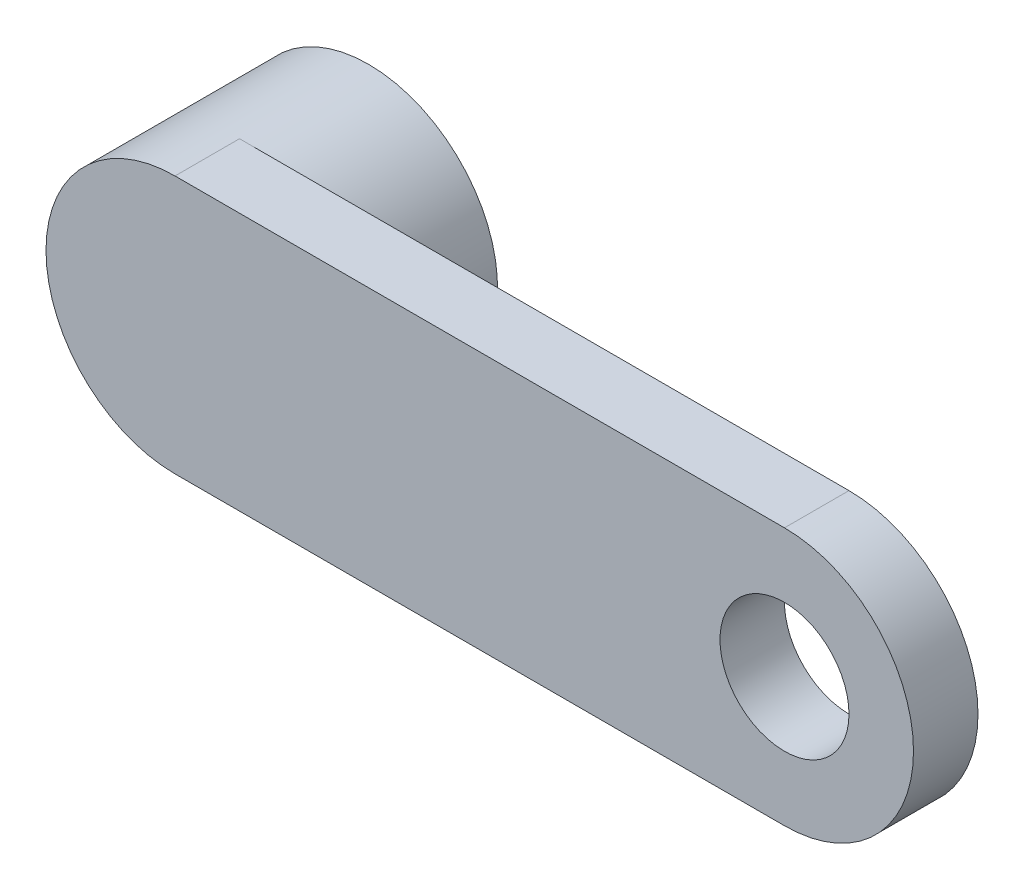
ISO-10303-21;
HEADER;
FILE_DESCRIPTION(('STEP AP214'),'2;1');
FILE_NAME('part.step','',(''),(''),'','','');
FILE_SCHEMA(('AUTOMOTIVE_DESIGN { 1 0 10303 214 1 1 1 1 }'));
ENDSEC;
DATA;
#1=APPLICATION_CONTEXT('core data for automotive mechanical design processes');
#2=APPLICATION_PROTOCOL_DEFINITION('international standard','automotive_design',2000,#1);
#3=PRODUCT_CONTEXT('',#1,'mechanical');
#4=PRODUCT('Part','Part','',(#3));
#5=PRODUCT_RELATED_PRODUCT_CATEGORY('part','',(#4));
#6=PRODUCT_DEFINITION_FORMATION('','',#4);
#7=PRODUCT_DEFINITION_CONTEXT('part definition',#1,'design');
#8=PRODUCT_DEFINITION('design','',#6,#7);
#9=PRODUCT_DEFINITION_SHAPE('','',#8);
#10=(LENGTH_UNIT() NAMED_UNIT(*) SI_UNIT(.MILLI.,.METRE.));
#11=(NAMED_UNIT(*) PLANE_ANGLE_UNIT() SI_UNIT($,.RADIAN.));
#12=(NAMED_UNIT(*) SI_UNIT($,.STERADIAN.) SOLID_ANGLE_UNIT());
#13=UNCERTAINTY_MEASURE_WITH_UNIT(LENGTH_MEASURE(1.E-05),#10,'distance_accuracy_value','');
#14=(GEOMETRIC_REPRESENTATION_CONTEXT(3) GLOBAL_UNCERTAINTY_ASSIGNED_CONTEXT((#13)) GLOBAL_UNIT_ASSIGNED_CONTEXT((#10,
#11,#12)) REPRESENTATION_CONTEXT('',''));
#15=CARTESIAN_POINT('',(0.,0.,0.));
#16=DIRECTION('',(0.,0.,1.));
#17=DIRECTION('',(1.,0.,0.));
#18=AXIS2_PLACEMENT_3D('',#15,#16,#17);
#19=CARTESIAN_POINT('',(0.,0.,-1.5875));
#20=DIRECTION('',(0.,0.,1.));
#21=DIRECTION('',(1.,0.,0.));
#22=AXIS2_PLACEMENT_3D('',#19,#20,#21);
#23=PLANE('',#22);
#24=CARTESIAN_POINT('',(15.,0.,-1.5875));
#25=DIRECTION('',(0.,0.,1.));
#26=DIRECTION('',(1.,0.,0.));
#27=AXIS2_PLACEMENT_3D('',#24,#25,#26);
#28=CIRCLE('',#27,1.5875);
#29=CARTESIAN_POINT('',(16.5875,0.,-1.5875));
#30=VERTEX_POINT('',#29);
#31=EDGE_CURVE('E112',#30,#30,#28,.T.);
#32=ORIENTED_EDGE('',*,*,#31,.T.);
#33=EDGE_LOOP('',(#32));
#34=FACE_BOUND('',#33,.T.);
#35=CARTESIAN_POINT('',(0.,0.,-1.5875));
#36=DIRECTION('',(0.,0.,-1.));
#37=DIRECTION('',(-1.,0.,0.));
#38=AXIS2_PLACEMENT_3D('',#35,#36,#37);
#39=CIRCLE('',#38,3.175);
#40=CARTESIAN_POINT('',(0.,3.175,-1.5875));
#41=VERTEX_POINT('',#40);
#42=CARTESIAN_POINT('',(0.,-3.175,-1.5875));
#43=VERTEX_POINT('',#42);
#44=EDGE_CURVE('E74',#41,#43,#39,.T.);
#45=ORIENTED_EDGE('',*,*,#44,.F.);
#46=DIRECTION('',(-1.,0.,0.));
#47=VECTOR('',#46,1.);
#48=CARTESIAN_POINT('',(0.,3.175,-1.5875));
#49=LINE('',#48,#47);
#50=CARTESIAN_POINT('',(15.,3.175,-1.5875));
#51=VERTEX_POINT('',#50);
#52=EDGE_CURVE('E81',#51,#41,#49,.T.);
#53=ORIENTED_EDGE('',*,*,#52,.F.);
#54=CARTESIAN_POINT('',(15.,0.,-1.5875));
#55=DIRECTION('',(0.,0.,1.));
#56=DIRECTION('',(1.,0.,0.));
#57=AXIS2_PLACEMENT_3D('',#54,#55,#56);
#58=CIRCLE('',#57,3.175);
#59=CARTESIAN_POINT('',(15.,-3.17499999999994,-1.5875));
#60=VERTEX_POINT('',#59);
#61=EDGE_CURVE('E93',#60,#51,#58,.T.);
#62=ORIENTED_EDGE('',*,*,#61,.F.);
#63=DIRECTION('',(1.,0.,0.));
#64=VECTOR('',#63,1.);
#65=CARTESIAN_POINT('',(0.,-3.175,-1.5875));
#66=LINE('',#65,#64);
#67=EDGE_CURVE('E83',#43,#60,#66,.T.);
#68=ORIENTED_EDGE('',*,*,#67,.F.);
#69=EDGE_LOOP('',(#45,#53,#62,#68));
#70=FACE_BOUND('',#69,.T.);
#71=ADVANCED_FACE('F34',(#34,#70),#23,.F.);
#72=CARTESIAN_POINT('',(0.,0.,-1.5875));
#73=DIRECTION('',(0.,0.,1.));
#74=DIRECTION('',(1.,0.,0.));
#75=AXIS2_PLACEMENT_3D('',#72,#73,#74);
#76=CYLINDRICAL_SURFACE('',#75,3.175);
#77=CARTESIAN_POINT('',(0.,0.,0.));
#78=DIRECTION('',(0.,0.,1.));
#79=DIRECTION('',(1.,0.,0.));
#80=AXIS2_PLACEMENT_3D('',#77,#78,#79);
#81=CIRCLE('',#80,3.175);
#82=CARTESIAN_POINT('',(0.,3.175,0.));
#83=VERTEX_POINT('',#82);
#84=CARTESIAN_POINT('',(0.,-3.175,0.));
#85=VERTEX_POINT('',#84);
#86=EDGE_CURVE('E89',#83,#85,#81,.T.);
#87=ORIENTED_EDGE('',*,*,#86,.F.);
#88=DIRECTION('',(0.,0.,1.));
#89=VECTOR('',#88,1.);
#90=CARTESIAN_POINT('',(0.,3.175,-1.5875));
#91=LINE('',#90,#89);
#92=EDGE_CURVE('E11',#41,#83,#91,.T.);
#93=ORIENTED_EDGE('',*,*,#92,.F.);
#94=ORIENTED_EDGE('',*,*,#44,.T.);
#95=DIRECTION('',(0.,0.,1.));
#96=VECTOR('',#95,1.);
#97=CARTESIAN_POINT('',(0.,-3.175,-1.5875));
#98=LINE('',#97,#96);
#99=EDGE_CURVE('E92',#43,#85,#98,.T.);
#100=ORIENTED_EDGE('',*,*,#99,.T.);
#101=EDGE_LOOP('',(#87,#93,#94,#100));
#102=FACE_BOUND('',#101,.T.);
#103=CARTESIAN_POINT('',(0.,0.,-4.7625));
#104=DIRECTION('',(0.,0.,-1.));
#105=DIRECTION('',(-1.,0.,0.));
#106=AXIS2_PLACEMENT_3D('',#103,#104,#105);
#107=CIRCLE('',#106,3.175);
#108=CARTESIAN_POINT('',(-3.175,0.,-4.7625));
#109=VERTEX_POINT('',#108);
#110=EDGE_CURVE('E84',#109,#109,#107,.T.);
#111=ORIENTED_EDGE('',*,*,#110,.F.);
#112=EDGE_LOOP('',(#111));
#113=FACE_BOUND('',#112,.T.);
#114=ADVANCED_FACE('F36',(#102,#113),#76,.T.);
#115=CARTESIAN_POINT('',(0.,3.175,-1.5875));
#116=DIRECTION('',(0.,1.,0.));
#117=DIRECTION('',(0.,0.,1.));
#118=AXIS2_PLACEMENT_3D('',#115,#116,#117);
#119=PLANE('',#118);
#120=DIRECTION('',(-1.,0.,0.));
#121=VECTOR('',#120,1.);
#122=CARTESIAN_POINT('',(0.,3.175,0.));
#123=LINE('',#122,#121);
#124=CARTESIAN_POINT('',(15.,3.175,0.));
#125=VERTEX_POINT('',#124);
#126=EDGE_CURVE('E103',#125,#83,#123,.T.);
#127=ORIENTED_EDGE('',*,*,#126,.F.);
#128=DIRECTION('',(0.,0.,1.));
#129=VECTOR('',#128,1.);
#130=CARTESIAN_POINT('',(15.,3.175,-1.5875));
#131=LINE('',#130,#129);
#132=EDGE_CURVE('E44',#51,#125,#131,.T.);
#133=ORIENTED_EDGE('',*,*,#132,.F.);
#134=ORIENTED_EDGE('',*,*,#52,.T.);
#135=ORIENTED_EDGE('',*,*,#92,.T.);
#136=EDGE_LOOP('',(#127,#133,#134,#135));
#137=FACE_BOUND('',#136,.T.);
#138=ADVANCED_FACE('F91',(#137),#119,.T.);
#139=CARTESIAN_POINT('',(15.,0.,-1.5875));
#140=DIRECTION('',(0.,0.,1.));
#141=DIRECTION('',(1.,0.,0.));
#142=AXIS2_PLACEMENT_3D('',#139,#140,#141);
#143=CYLINDRICAL_SURFACE('',#142,3.175);
#144=CARTESIAN_POINT('',(15.,0.,0.));
#145=DIRECTION('',(0.,0.,1.));
#146=DIRECTION('',(1.,0.,0.));
#147=AXIS2_PLACEMENT_3D('',#144,#145,#146);
#148=CIRCLE('',#147,3.175);
#149=CARTESIAN_POINT('',(15.,-3.17499999999994,0.));
#150=VERTEX_POINT('',#149);
#151=EDGE_CURVE('E122',#150,#125,#148,.T.);
#152=ORIENTED_EDGE('',*,*,#151,.F.);
#153=DIRECTION('',(0.,0.,1.));
#154=VECTOR('',#153,1.);
#155=CARTESIAN_POINT('',(15.,-3.17499999999994,-1.5875));
#156=LINE('',#155,#154);
#157=EDGE_CURVE('E94',#60,#150,#156,.T.);
#158=ORIENTED_EDGE('',*,*,#157,.F.);
#159=ORIENTED_EDGE('',*,*,#61,.T.);
#160=ORIENTED_EDGE('',*,*,#132,.T.);
#161=EDGE_LOOP('',(#152,#158,#159,#160));
#162=FACE_BOUND('',#161,.T.);
#163=ADVANCED_FACE('F127',(#162),#143,.T.);
#164=CARTESIAN_POINT('',(0.,-3.175,-1.5875));
#165=DIRECTION('',(0.,-1.,0.));
#166=DIRECTION('',(1.,0.,0.));
#167=AXIS2_PLACEMENT_3D('',#164,#165,#166);
#168=PLANE('',#167);
#169=DIRECTION('',(1.,0.,0.));
#170=VECTOR('',#169,1.);
#171=CARTESIAN_POINT('',(0.,-3.175,0.));
#172=LINE('',#171,#170);
#173=EDGE_CURVE('E119',#85,#150,#172,.T.);
#174=ORIENTED_EDGE('',*,*,#173,.F.);
#175=ORIENTED_EDGE('',*,*,#99,.F.);
#176=ORIENTED_EDGE('',*,*,#67,.T.);
#177=ORIENTED_EDGE('',*,*,#157,.T.);
#178=EDGE_LOOP('',(#174,#175,#176,#177));
#179=FACE_BOUND('',#178,.T.);
#180=ADVANCED_FACE('F126',(#179),#168,.T.);
#181=CARTESIAN_POINT('',(0.,0.,0.));
#182=DIRECTION('',(0.,0.,1.));
#183=DIRECTION('',(1.,0.,0.));
#184=AXIS2_PLACEMENT_3D('',#181,#182,#183);
#185=PLANE('',#184);
#186=CARTESIAN_POINT('',(15.,0.,0.));
#187=DIRECTION('',(0.,0.,1.));
#188=DIRECTION('',(1.,0.,0.));
#189=AXIS2_PLACEMENT_3D('',#186,#187,#188);
#190=CIRCLE('',#189,1.5875);
#191=CARTESIAN_POINT('',(16.5875,0.,0.));
#192=VERTEX_POINT('',#191);
#193=EDGE_CURVE('E115',#192,#192,#190,.T.);
#194=ORIENTED_EDGE('',*,*,#193,.F.);
#195=EDGE_LOOP('',(#194));
#196=FACE_BOUND('',#195,.T.);
#197=ORIENTED_EDGE('',*,*,#86,.T.);
#198=ORIENTED_EDGE('',*,*,#173,.T.);
#199=ORIENTED_EDGE('',*,*,#151,.T.);
#200=ORIENTED_EDGE('',*,*,#126,.T.);
#201=EDGE_LOOP('',(#197,#198,#199,#200));
#202=FACE_BOUND('',#201,.T.);
#203=ADVANCED_FACE('F129',(#196,#202),#185,.T.);
#204=CARTESIAN_POINT('',(15.,0.,-1.5875));
#205=DIRECTION('',(0.,0.,1.));
#206=DIRECTION('',(1.,0.,0.));
#207=AXIS2_PLACEMENT_3D('',#204,#205,#206);
#208=CYLINDRICAL_SURFACE('',#207,1.5875);
#209=ORIENTED_EDGE('',*,*,#31,.F.);
#210=EDGE_LOOP('',(#209));
#211=FACE_BOUND('',#210,.T.);
#212=ORIENTED_EDGE('',*,*,#193,.T.);
#213=EDGE_LOOP('',(#212));
#214=FACE_BOUND('',#213,.T.);
#215=ADVANCED_FACE('F131',(#211,#214),#208,.F.);
#216=CARTESIAN_POINT('',(0.,0.,-4.7625));
#217=DIRECTION('',(0.,0.,-1.));
#218=DIRECTION('',(-1.,0.,0.));
#219=AXIS2_PLACEMENT_3D('',#216,#217,#218);
#220=PLANE('',#219);
#221=ORIENTED_EDGE('',*,*,#110,.T.);
#222=EDGE_LOOP('',(#221));
#223=FACE_BOUND('',#222,.T.);
#224=CARTESIAN_POINT('',(0.,0.,-4.7625));
#225=DIRECTION('',(0.,0.,-1.));
#226=DIRECTION('',(-1.,0.,0.));
#227=AXIS2_PLACEMENT_3D('',#224,#225,#226);
#228=CIRCLE('',#227,1.5875);
#229=CARTESIAN_POINT('',(-1.5875,0.,-4.7625));
#230=VERTEX_POINT('',#229);
#231=EDGE_CURVE('E85',#230,#230,#228,.T.);
#232=ORIENTED_EDGE('',*,*,#231,.F.);
#233=EDGE_LOOP('',(#232));
#234=FACE_BOUND('',#233,.T.);
#235=ADVANCED_FACE('F138',(#223,#234),#220,.T.);
#236=CARTESIAN_POINT('',(0.,0.,-4.7625));
#237=DIRECTION('',(0.,0.,1.));
#238=DIRECTION('',(1.,0.,0.));
#239=AXIS2_PLACEMENT_3D('',#236,#237,#238);
#240=CYLINDRICAL_SURFACE('',#239,1.5875);
#241=ORIENTED_EDGE('',*,*,#231,.T.);
#242=EDGE_LOOP('',(#241));
#243=FACE_BOUND('',#242,.T.);
#244=CARTESIAN_POINT('',(0.,0.,-1.5875));
#245=DIRECTION('',(0.,0.,-1.));
#246=DIRECTION('',(-1.,0.,0.));
#247=AXIS2_PLACEMENT_3D('',#244,#245,#246);
#248=CIRCLE('',#247,1.5875);
#249=CARTESIAN_POINT('',(-1.5875,0.,-1.5875));
#250=VERTEX_POINT('',#249);
#251=EDGE_CURVE('E160',#250,#250,#248,.T.);
#252=ORIENTED_EDGE('',*,*,#251,.F.);
#253=EDGE_LOOP('',(#252));
#254=FACE_BOUND('',#253,.T.);
#255=ADVANCED_FACE('F151',(#243,#254),#240,.F.);
#256=ORIENTED_EDGE('',*,*,#251,.T.);
#257=EDGE_LOOP('',(#256));
#258=FACE_BOUND('',#257,.T.);
#259=ADVANCED_FACE('F146',(#258),#23,.F.);
#260=CLOSED_SHELL('',(#71,#114,#138,#163,#180,#203,#215,#235,#255,#259));
#261=MANIFOLD_SOLID_BREP('B2',#260);
#262=ADVANCED_BREP_SHAPE_REPRESENTATION('',(#18,#261),#14);
#263=SHAPE_DEFINITION_REPRESENTATION(#9,#262);
ENDSEC;
END-ISO-10303-21;
